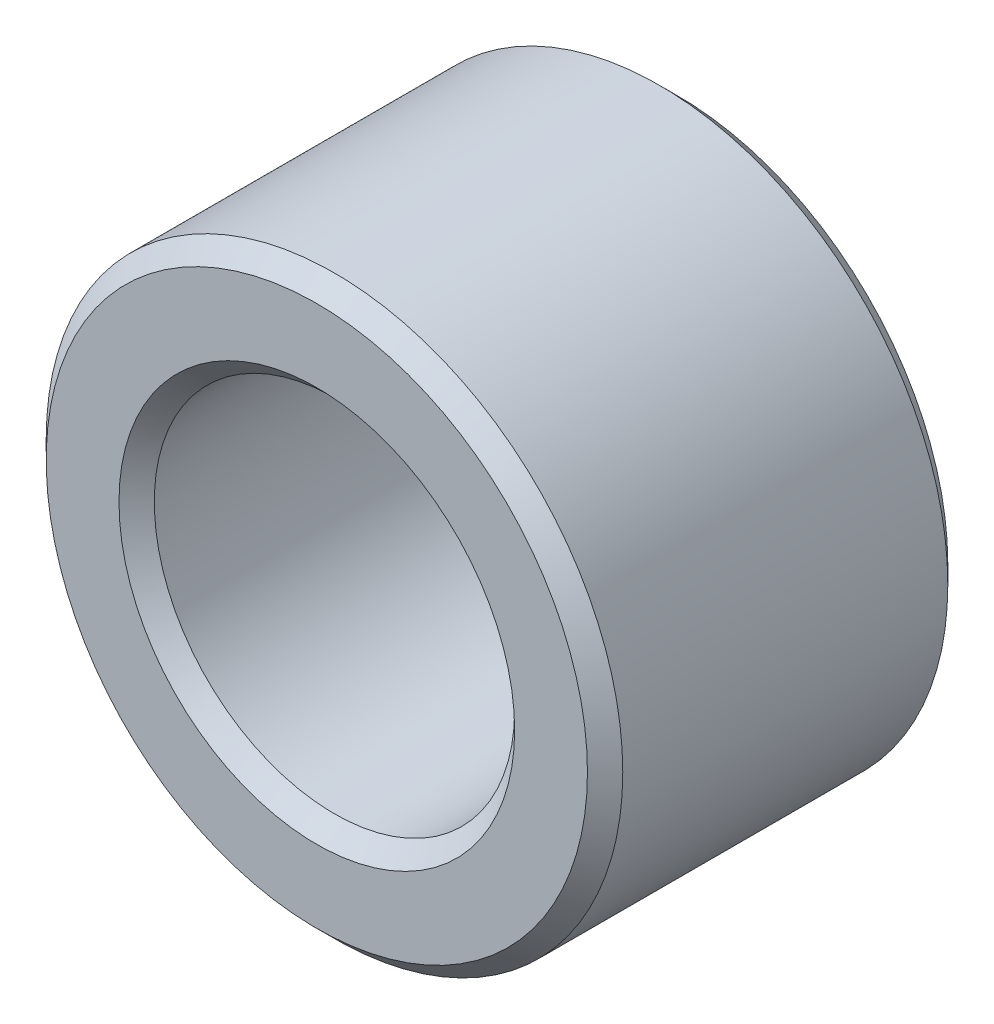
ISO-10303-21;
HEADER;
FILE_DESCRIPTION(('STEP AP214'),'2;1');
FILE_NAME('part.step','',(''),(''),'','','');
FILE_SCHEMA(('AUTOMOTIVE_DESIGN { 1 0 10303 214 1 1 1 1 }'));
ENDSEC;
DATA;
#1=APPLICATION_CONTEXT('core data for automotive mechanical design processes');
#2=APPLICATION_PROTOCOL_DEFINITION('international standard','automotive_design',2000,#1);
#3=PRODUCT_CONTEXT('',#1,'mechanical');
#4=PRODUCT('Part','Part','',(#3));
#5=PRODUCT_RELATED_PRODUCT_CATEGORY('part','',(#4));
#6=PRODUCT_DEFINITION_FORMATION('','',#4);
#7=PRODUCT_DEFINITION_CONTEXT('part definition',#1,'design');
#8=PRODUCT_DEFINITION('design','',#6,#7);
#9=PRODUCT_DEFINITION_SHAPE('','',#8);
#10=(LENGTH_UNIT() NAMED_UNIT(*) SI_UNIT(.MILLI.,.METRE.));
#11=(NAMED_UNIT(*) PLANE_ANGLE_UNIT() SI_UNIT($,.RADIAN.));
#12=(NAMED_UNIT(*) SI_UNIT($,.STERADIAN.) SOLID_ANGLE_UNIT());
#13=UNCERTAINTY_MEASURE_WITH_UNIT(LENGTH_MEASURE(1.E-05),#10,'distance_accuracy_value','');
#14=(GEOMETRIC_REPRESENTATION_CONTEXT(3) GLOBAL_UNCERTAINTY_ASSIGNED_CONTEXT((#13)) GLOBAL_UNIT_ASSIGNED_CONTEXT((#10,
#11,#12)) REPRESENTATION_CONTEXT('',''));
#15=CARTESIAN_POINT('',(0.,0.,0.));
#16=DIRECTION('',(0.,0.,1.));
#17=DIRECTION('',(1.,0.,0.));
#18=AXIS2_PLACEMENT_3D('',#15,#16,#17);
#19=CARTESIAN_POINT('',(33.2499999916199,61.2600000000035,-5.1225));
#20=DIRECTION('',(0.,0.,-1.));
#21=DIRECTION('',(-1.,0.,0.));
#22=AXIS2_PLACEMENT_3D('',#19,#20,#21);
#23=CONICAL_SURFACE('',#22,3.8775,0.785398163397424);
#24=CARTESIAN_POINT('',(33.2499999916199,61.2600000000035,-4.99999999999994));
#25=DIRECTION('',(0.,0.,-1.));
#26=DIRECTION('',(-1.,0.,0.));
#27=AXIS2_PLACEMENT_3D('',#24,#25,#26);
#28=CIRCLE('',#27,3.755);
#29=CARTESIAN_POINT('',(37.0049999916199,61.2600000000035,-4.99999999999994));
#30=VERTEX_POINT('',#29);
#31=EDGE_CURVE('E91',#30,#30,#28,.T.);
#32=ORIENTED_EDGE('',*,*,#31,.T.);
#33=DIRECTION('',(0.70710678118653,0.,-0.707106781186565));
#34=VECTOR('',#33,1.);
#35=CARTESIAN_POINT('',(37.1274999916199,61.2600000000035,-5.1225));
#36=LINE('',#35,#34);
#37=CARTESIAN_POINT('',(37.2499999916199,61.2600000000035,-5.245));
#38=VERTEX_POINT('',#37);
#39=EDGE_CURVE('E11',#30,#38,#36,.T.);
#40=ORIENTED_EDGE('',*,*,#39,.T.);
#41=CARTESIAN_POINT('',(33.2499999916199,61.2600000000035,-5.245));
#42=DIRECTION('',(0.,0.,1.));
#43=DIRECTION('',(-1.,0.,0.));
#44=AXIS2_PLACEMENT_3D('',#41,#42,#43);
#45=CIRCLE('',#44,4.);
#46=EDGE_CURVE('E80',#38,#38,#45,.T.);
#47=ORIENTED_EDGE('',*,*,#46,.T.);
#48=ORIENTED_EDGE('',*,*,#39,.F.);
#49=EDGE_LOOP('',(#32,#40,#47,#48));
#50=FACE_BOUND('',#49,.T.);
#51=ADVANCED_FACE('F17',(#50),#23,.T.);
#52=CARTESIAN_POINT('',(33.2499999916199,61.2600000000035,-10.));
#53=DIRECTION('',(0.,0.,1.));
#54=DIRECTION('',(-1.,0.,0.));
#55=AXIS2_PLACEMENT_3D('',#52,#53,#54);
#56=CYLINDRICAL_SURFACE('',#55,4.);
#57=CARTESIAN_POINT('',(29.2500010161561,61.2571370839422,-7.49999999999989));
#58=CARTESIAN_POINT('',(29.2500010161561,61.2571370839422,-7.50035955681426));
#59=CARTESIAN_POINT('',(29.2500009623511,61.2572088703885,-7.50074310509997));
#60=CARTESIAN_POINT('',(29.2500007700237,61.2575008918936,-7.50144875598005));
#61=CARTESIAN_POINT('',(29.2500006327074,61.2577211234036,-7.50177086004336));
#62=CARTESIAN_POINT('',(29.2500003754214,61.2582294045914,-7.50227962789005));
#63=CARTESIAN_POINT('',(29.2500002379956,61.2585513492288,-7.50250018787385));
#64=CARTESIAN_POINT('',(29.2500000454901,61.2592568448792,-7.50279268274081));
#65=CARTESIAN_POINT('',(29.2499999916199,61.2596403944201,-7.50286462117544));
#66=CARTESIAN_POINT('',(29.2499999916199,61.2603596055863,-7.50286462117544));
#67=CARTESIAN_POINT('',(29.2500000454901,61.2607431551272,-7.50279268274081));
#68=CARTESIAN_POINT('',(29.2500002379956,61.2614486507776,-7.50250018787385));
#69=CARTESIAN_POINT('',(29.2500003754214,61.261770595415,-7.50227962789005));
#70=CARTESIAN_POINT('',(29.2500006327074,61.2622788766028,-7.50177086004336));
#71=CARTESIAN_POINT('',(29.2500007700237,61.2624991081128,-7.50144875598005));
#72=CARTESIAN_POINT('',(29.2500009623511,61.2627911296179,-7.50074310509997));
#73=CARTESIAN_POINT('',(29.2500010161561,61.2628629160642,-7.50035955681426));
#74=CARTESIAN_POINT('',(29.2500010161561,61.2628629160642,-7.49999999999989));
#75=(BOUNDED_CURVE() B_SPLINE_CURVE(3,(#57,#58,#59,#60,#61,#62,#63,#64,#65,#66,#67,#68,#69,#70,
#71,#72,#73,#74),.UNSPECIFIED.,.F.,.F.) B_SPLINE_CURVE_WITH_KNOTS((4,2,2,2,2,2,2,2,4),(0.,
0.000107867044312072,0.000215734088624143,0.000323615763548347,0.000431497438472551,
0.000539379113396748,0.000647260788320945,0.000755127832633169,0.000862994876945392),
.UNSPECIFIED.) CURVE() GEOMETRIC_REPRESENTATION_ITEM() RATIONAL_B_SPLINE_CURVE((1.,1.,1.,1.,1.,
1.,1.,1.,1.,1.,1.,1.,1.,1.,1.,1.,1.,1.)) REPRESENTATION_ITEM(''));
#76=CARTESIAN_POINT('',(29.2500010161561,61.2571370839422,-7.49999999999989));
#77=VERTEX_POINT('',#76);
#78=CARTESIAN_POINT('',(29.2499999916199,61.2628646211788,-7.49999999999989));
#79=VERTEX_POINT('',#78);
#80=EDGE_CURVE('E280',#77,#79,#75,.T.);
#81=ORIENTED_EDGE('',*,*,#80,.T.);
#82=CARTESIAN_POINT('',(29.2500010161561,61.2628629160642,-7.49999999999989));
#83=CARTESIAN_POINT('',(29.2500010161561,61.2628629160642,-7.4996404992047));
#84=CARTESIAN_POINT('',(29.2500009623683,61.2627911518043,-7.49925700685589));
#85=CARTESIAN_POINT('',(29.2500007700912,61.2624992139424,-7.49855144143439));
#86=CARTESIAN_POINT('',(29.2500006328071,61.2622790438867,-7.49822936689402));
#87=CARTESIAN_POINT('',(29.2500003755212,61.2617708221764,-7.49772053962343));
#88=CARTESIAN_POINT('',(29.2500002380631,61.2614488480897,-7.49749991811765));
#89=CARTESIAN_POINT('',(29.2500000455073,61.2607432670712,-7.49720733949506));
#90=CARTESIAN_POINT('',(29.2499999916199,61.2603596616127,-7.49713537882434));
#91=CARTESIAN_POINT('',(29.2499999916199,61.2596403383937,-7.49713537882434));
#92=CARTESIAN_POINT('',(29.2500000455073,61.2592567329353,-7.49720733949505));
#93=CARTESIAN_POINT('',(29.2500002380631,61.2585511519168,-7.49749991811765));
#94=CARTESIAN_POINT('',(29.2500003755212,61.2582291778301,-7.49772053962343));
#95=CARTESIAN_POINT('',(29.2500006328071,61.2577209561198,-7.49822936689402));
#96=CARTESIAN_POINT('',(29.2500007700912,61.2575007860641,-7.49855144143439));
#97=CARTESIAN_POINT('',(29.2500009623683,61.2572088482021,-7.49925700685589));
#98=CARTESIAN_POINT('',(29.2500010161561,61.2571370839422,-7.4996404992047));
#99=CARTESIAN_POINT('',(29.2500010161561,61.2571370839422,-7.49999999999989));
#100=(BOUNDED_CURVE() B_SPLINE_CURVE(3,(#82,#83,#84,#85,#86,#87,#88,#89,#90,#91,#92,#93,#94,#95,
#96,#97,#98,#99),.UNSPECIFIED.,.F.,.F.) B_SPLINE_CURVE_WITH_KNOTS((4,2,2,2,2,2,2,2,4),
(0.000862994876945392,0.000970845115503968,0.00107869535406254,0.00118659383691251,
0.00129449231976247,0.00140239080261283,0.00151028928546318,0.00161813952402152,
0.00172598976257986),
.UNSPECIFIED.) CURVE() GEOMETRIC_REPRESENTATION_ITEM() RATIONAL_B_SPLINE_CURVE((1.,1.,1.,1.,1.,
1.,1.,1.,1.,1.,1.,1.,1.,1.,1.,1.,1.,1.)) REPRESENTATION_ITEM(''));
#101=EDGE_CURVE('E274',#79,#77,#100,.T.);
#102=ORIENTED_EDGE('',*,*,#101,.T.);
#103=EDGE_LOOP('',(#81,#102));
#104=FACE_BOUND('',#103,.T.);
#105=ORIENTED_EDGE('',*,*,#46,.F.);
#106=DIRECTION('',(0.,0.,-1.));
#107=VECTOR('',#106,1.);
#108=CARTESIAN_POINT('',(37.2499999916199,61.2600000000035,-10.));
#109=LINE('',#108,#107);
#110=CARTESIAN_POINT('',(37.2499999916199,61.2600000000035,-9.755));
#111=VERTEX_POINT('',#110);
#112=EDGE_CURVE('E27',#38,#111,#109,.T.);
#113=ORIENTED_EDGE('',*,*,#112,.T.);
#114=CARTESIAN_POINT('',(33.2499999916199,61.2600000000035,-9.755));
#115=DIRECTION('',(0.,0.,-1.));
#116=DIRECTION('',(-1.,0.,0.));
#117=AXIS2_PLACEMENT_3D('',#114,#115,#116);
#118=CIRCLE('',#117,4.);
#119=EDGE_CURVE('E20',#111,#111,#118,.T.);
#120=ORIENTED_EDGE('',*,*,#119,.F.);
#121=ORIENTED_EDGE('',*,*,#112,.F.);
#122=EDGE_LOOP('',(#105,#113,#120,#121));
#123=FACE_BOUND('',#122,.T.);
#124=ADVANCED_FACE('F157',(#104,#123),#56,.T.);
#125=CARTESIAN_POINT('',(33.2499999916199,61.2600000000035,-9.8775));
#126=DIRECTION('',(0.,0.,1.));
#127=DIRECTION('',(-1.,0.,0.));
#128=AXIS2_PLACEMENT_3D('',#125,#126,#127);
#129=CONICAL_SURFACE('',#128,3.8775,0.78539816339748);
#130=ORIENTED_EDGE('',*,*,#119,.T.);
#131=DIRECTION('',(-0.70710678118657,0.,-0.707106781186525));
#132=VECTOR('',#131,1.);
#133=CARTESIAN_POINT('',(37.1274999916199,61.2600000000035,-9.8775));
#134=LINE('',#133,#132);
#135=CARTESIAN_POINT('',(37.0049999916199,61.2600000000035,-10.));
#136=VERTEX_POINT('',#135);
#137=EDGE_CURVE('E74',#111,#136,#134,.T.);
#138=ORIENTED_EDGE('',*,*,#137,.T.);
#139=CARTESIAN_POINT('',(33.2499999916199,61.2600000000035,-10.));
#140=DIRECTION('',(0.,0.,1.));
#141=DIRECTION('',(-1.,0.,0.));
#142=AXIS2_PLACEMENT_3D('',#139,#140,#141);
#143=CIRCLE('',#142,3.755);
#144=EDGE_CURVE('E77',#136,#136,#143,.T.);
#145=ORIENTED_EDGE('',*,*,#144,.T.);
#146=ORIENTED_EDGE('',*,*,#137,.F.);
#147=EDGE_LOOP('',(#130,#138,#145,#146));
#148=FACE_BOUND('',#147,.T.);
#149=ADVANCED_FACE('F75',(#148),#129,.T.);
#150=CARTESIAN_POINT('',(40.0998250928018,79.6300000000035,-10.));
#151=DIRECTION('',(0.,0.,1.));
#152=DIRECTION('',(0.,-1.,0.));
#153=AXIS2_PLACEMENT_3D('',#150,#151,#152);
#154=PLANE('',#153);
#155=CARTESIAN_POINT('',(33.2499999916199,61.2600000000035,-10.));
#156=DIRECTION('',(0.,0.,-1.));
#157=DIRECTION('',(-1.,0.,0.));
#158=AXIS2_PLACEMENT_3D('',#155,#156,#157);
#159=CIRCLE('',#158,2.745);
#160=CARTESIAN_POINT('',(35.9949999916199,61.2600000000035,-10.));
#161=VERTEX_POINT('',#160);
#162=EDGE_CURVE('E94',#161,#161,#159,.T.);
#163=ORIENTED_EDGE('',*,*,#162,.F.);
#164=EDGE_LOOP('',(#163));
#165=FACE_BOUND('',#164,.T.);
#166=ORIENTED_EDGE('',*,*,#144,.F.);
#167=EDGE_LOOP('',(#166));
#168=FACE_BOUND('',#167,.T.);
#169=ADVANCED_FACE('F152',(#165,#168),#154,.F.);
#170=CARTESIAN_POINT('',(33.2499999916199,61.2600000000035,-9.8775));
#171=DIRECTION('',(0.,0.,-1.));
#172=DIRECTION('',(-1.,0.,0.));
#173=AXIS2_PLACEMENT_3D('',#170,#171,#172);
#174=CONICAL_SURFACE('',#173,2.6225,0.785398163397484);
#175=CARTESIAN_POINT('',(33.2499999916199,61.2600000000035,-9.755));
#176=DIRECTION('',(0.,0.,1.));
#177=DIRECTION('',(-1.,0.,0.));
#178=AXIS2_PLACEMENT_3D('',#175,#176,#177);
#179=CIRCLE('',#178,2.5);
#180=CARTESIAN_POINT('',(35.7499999916199,61.2600000000035,-9.755));
#181=VERTEX_POINT('',#180);
#182=EDGE_CURVE('E123',#181,#181,#179,.T.);
#183=ORIENTED_EDGE('',*,*,#182,.T.);
#184=DIRECTION('',(0.707106781186573,0.,-0.707106781186522));
#185=VECTOR('',#184,1.);
#186=CARTESIAN_POINT('',(35.8724999916199,61.2600000000035,-9.8775));
#187=LINE('',#186,#185);
#188=EDGE_CURVE('E98',#181,#161,#187,.T.);
#189=ORIENTED_EDGE('',*,*,#188,.T.);
#190=ORIENTED_EDGE('',*,*,#162,.T.);
#191=ORIENTED_EDGE('',*,*,#188,.F.);
#192=EDGE_LOOP('',(#183,#189,#190,#191));
#193=FACE_BOUND('',#192,.T.);
#194=ADVANCED_FACE('F140',(#193),#174,.F.);
#195=CARTESIAN_POINT('',(40.0998250928018,79.6300000000035,-5.));
#196=DIRECTION('',(0.,0.,1.));
#197=DIRECTION('',(0.,-1.,0.));
#198=AXIS2_PLACEMENT_3D('',#195,#196,#197);
#199=PLANE('',#198);
#200=CARTESIAN_POINT('',(33.2499999916199,61.2600000000035,-4.99999999999994));
#201=DIRECTION('',(0.,0.,1.));
#202=DIRECTION('',(-1.,0.,0.));
#203=AXIS2_PLACEMENT_3D('',#200,#201,#202);
#204=CIRCLE('',#203,2.745);
#205=CARTESIAN_POINT('',(35.9949999916199,61.2600000000035,-4.99999999999994));
#206=VERTEX_POINT('',#205);
#207=EDGE_CURVE('E118',#206,#206,#204,.T.);
#208=ORIENTED_EDGE('',*,*,#207,.F.);
#209=EDGE_LOOP('',(#208));
#210=FACE_BOUND('',#209,.T.);
#211=ORIENTED_EDGE('',*,*,#31,.F.);
#212=EDGE_LOOP('',(#211));
#213=FACE_BOUND('',#212,.T.);
#214=ADVANCED_FACE('F137',(#210,#213),#199,.T.);
#215=CARTESIAN_POINT('',(33.2499999916199,61.2600000000035,-10.));
#216=DIRECTION('',(0.,0.,1.));
#217=DIRECTION('',(-1.,0.,0.));
#218=AXIS2_PLACEMENT_3D('',#215,#216,#217);
#219=CYLINDRICAL_SURFACE('',#218,2.5);
#220=CARTESIAN_POINT('',(33.2499999916199,61.2600000000035,-5.24499999999994));
#221=DIRECTION('',(0.,0.,-1.));
#222=DIRECTION('',(-1.,0.,0.));
#223=AXIS2_PLACEMENT_3D('',#220,#221,#222);
#224=CIRCLE('',#223,2.5);
#225=CARTESIAN_POINT('',(35.7499999916199,61.2600000000035,-5.24499999999994));
#226=VERTEX_POINT('',#225);
#227=EDGE_CURVE('E109',#226,#226,#224,.T.);
#228=ORIENTED_EDGE('',*,*,#227,.F.);
#229=DIRECTION('',(0.,0.,-1.));
#230=VECTOR('',#229,1.);
#231=CARTESIAN_POINT('',(35.7499999916199,61.2600000000035,-10.));
#232=LINE('',#231,#230);
#233=EDGE_CURVE('E119',#226,#181,#232,.T.);
#234=ORIENTED_EDGE('',*,*,#233,.T.);
#235=ORIENTED_EDGE('',*,*,#182,.F.);
#236=ORIENTED_EDGE('',*,*,#233,.F.);
#237=EDGE_LOOP('',(#228,#234,#235,#236));
#238=FACE_BOUND('',#237,.T.);
#239=ADVANCED_FACE('F139',(#238),#219,.F.);
#240=CARTESIAN_POINT('',(33.2499999916199,61.2600000000035,-5.12249999999994));
#241=DIRECTION('',(0.,0.,1.));
#242=DIRECTION('',(-1.,0.,0.));
#243=AXIS2_PLACEMENT_3D('',#240,#241,#242);
#244=CONICAL_SURFACE('',#243,2.6225,0.785398163397419);
#245=ORIENTED_EDGE('',*,*,#227,.T.);
#246=DIRECTION('',(0.707106781186527,0.,0.707106781186568));
#247=VECTOR('',#246,1.);
#248=CARTESIAN_POINT('',(35.8724999916199,61.2600000000035,-5.12249999999994));
#249=LINE('',#248,#247);
#250=EDGE_CURVE('E113',#226,#206,#249,.T.);
#251=ORIENTED_EDGE('',*,*,#250,.T.);
#252=ORIENTED_EDGE('',*,*,#207,.T.);
#253=ORIENTED_EDGE('',*,*,#250,.F.);
#254=EDGE_LOOP('',(#245,#251,#252,#253));
#255=FACE_BOUND('',#254,.T.);
#256=ADVANCED_FACE('F149',(#255),#244,.F.);
#257=CARTESIAN_POINT('',(28.6508606106452,61.2600000000032,-7.49999999999988));
#258=DIRECTION('',(-1.,0.,0.));
#259=DIRECTION('',(0.,-1.,0.));
#260=AXIS2_PLACEMENT_3D('',#257,#258,#259);
#261=CONICAL_SURFACE('',#260,1.,1.02974425867665);
#262=ORIENTED_EDGE('',*,*,#80,.F.);
#263=ORIENTED_EDGE('',*,*,#101,.F.);
#264=DIRECTION('',(0.515038074910051,-0.857167300702114,0.));
#265=VECTOR('',#264,1.);
#266=CARTESIAN_POINT('',(28.6508606106452,62.2600000000032,-7.49999999999988));
#267=LINE('',#266,#265);
#268=CARTESIAN_POINT('',(29.2517212296727,61.2600000000032,-7.49999999999989));
#269=VERTEX_POINT('',#268);
#270=EDGE_CURVE('E114',#79,#269,#267,.T.);
#271=ORIENTED_EDGE('',*,*,#270,.T.);
#272=ORIENTED_EDGE('',*,*,#270,.F.);
#273=EDGE_LOOP('',(#262,#263,#271,#272));
#274=FACE_BOUND('',#273,.T.);
#275=ADVANCED_FACE('F230',(#274),#261,.F.);
#276=CLOSED_SHELL('',(#51,#124,#149,#169,#194,#214,#239,#256,#275));
#277=MANIFOLD_SOLID_BREP('B1',#276);
#278=ADVANCED_BREP_SHAPE_REPRESENTATION('',(#18,#277),#14);
#279=SHAPE_DEFINITION_REPRESENTATION(#9,#278);
ENDSEC;
END-ISO-10303-21;
